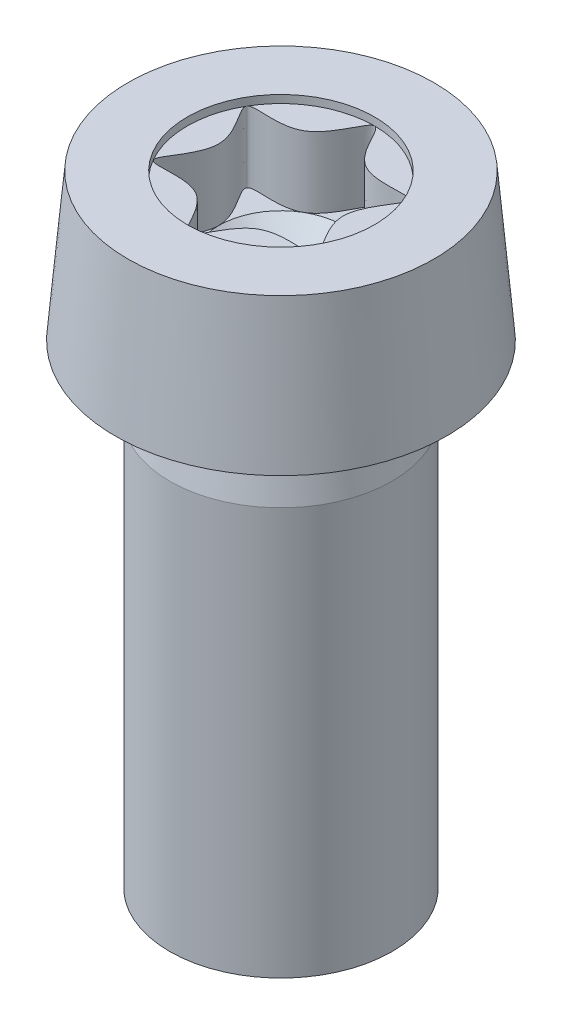
ISO-10303-21;
HEADER;
FILE_DESCRIPTION(('STEP AP214'),'2;1');
FILE_NAME('part.step','',(''),(''),'','','');
FILE_SCHEMA(('AUTOMOTIVE_DESIGN { 1 0 10303 214 1 1 1 1 }'));
ENDSEC;
DATA;
#1=APPLICATION_CONTEXT('core data for automotive mechanical design processes');
#2=APPLICATION_PROTOCOL_DEFINITION('international standard','automotive_design',2000,#1);
#3=PRODUCT_CONTEXT('',#1,'mechanical');
#4=PRODUCT('Part','Part','',(#3));
#5=PRODUCT_RELATED_PRODUCT_CATEGORY('part','',(#4));
#6=PRODUCT_DEFINITION_FORMATION('','',#4);
#7=PRODUCT_DEFINITION_CONTEXT('part definition',#1,'design');
#8=PRODUCT_DEFINITION('design','',#6,#7);
#9=PRODUCT_DEFINITION_SHAPE('','',#8);
#10=(LENGTH_UNIT() NAMED_UNIT(*) SI_UNIT(.MILLI.,.METRE.));
#11=(NAMED_UNIT(*) PLANE_ANGLE_UNIT() SI_UNIT($,.RADIAN.));
#12=(NAMED_UNIT(*) SI_UNIT($,.STERADIAN.) SOLID_ANGLE_UNIT());
#13=UNCERTAINTY_MEASURE_WITH_UNIT(LENGTH_MEASURE(1.E-05),#10,'distance_accuracy_value','');
#14=(GEOMETRIC_REPRESENTATION_CONTEXT(3) GLOBAL_UNCERTAINTY_ASSIGNED_CONTEXT((#13)) GLOBAL_UNIT_ASSIGNED_CONTEXT((#10,
#11,#12)) REPRESENTATION_CONTEXT('',''));
#15=CARTESIAN_POINT('',(0.,0.,0.));
#16=DIRECTION('',(0.,0.,1.));
#17=DIRECTION('',(1.,0.,0.));
#18=AXIS2_PLACEMENT_3D('',#15,#16,#17);
#19=CARTESIAN_POINT('',(0.,11.44,1.975));
#20=DIRECTION('',(0.,1.,0.));
#21=DIRECTION('',(0.,0.,1.));
#22=AXIS2_PLACEMENT_3D('',#19,#20,#21);
#23=PLANE('',#22);
#24=CARTESIAN_POINT('',(0.,11.44,-1.975));
#25=CARTESIAN_POINT('',(0.141989717055241,11.44,-1.975));
#26=CARTESIAN_POINT('',(0.425969151165719,11.44,-0.737800212276023));
#27=CARTESIAN_POINT('',(2.24612339533711,11.44,-1.296799946931));
#28=CARTESIAN_POINT('',(0.851938302331447,11.44,0.));
#29=CARTESIAN_POINT('',(2.24612339533711,11.44,1.29679994693099));
#30=CARTESIAN_POINT('',(0.425969151165728,11.44,0.737800212276034));
#31=CARTESIAN_POINT('',(0.,11.44,2.59359989386198));
#32=CARTESIAN_POINT('',(-0.425969151165736,11.44,0.737800212276045));
#33=CARTESIAN_POINT('',(-2.2461233953371,11.44,1.29679994693099));
#34=CARTESIAN_POINT('',(-0.851938302331446,11.44,0.));
#35=CARTESIAN_POINT('',(-2.2461233953371,11.44,-1.29679994693099));
#36=CARTESIAN_POINT('',(-0.425969151165735,11.44,-0.73780021227603));
#37=CARTESIAN_POINT('',(-0.141989717055244,11.44,-1.975));
#38=CARTESIAN_POINT('',(0.,11.44,-1.975));
#39=B_SPLINE_CURVE_WITH_KNOTS('',3,(#24,#25,#26,#27,#28,#29,#30,#31,#32,#33,#34,#35,#36,#37,
#38),.UNSPECIFIED.,.T.,.F.,(4,1,1,1,1,1,1,1,1,1,1,1,4),(0.,0.0833333333333328,0.166666666666667,
0.25,0.333333333333334,0.416666666666668,0.5,0.583333333333334,0.666666666666667,0.75,
0.833333333333334,0.916666666666666,1.),.UNSPECIFIED.);
#40=CARTESIAN_POINT('',(0.65833333333333,11.44,-1.14026678164951));
#41=VERTEX_POINT('',#40);
#42=CARTESIAN_POINT('',(1.31666666666667,11.44,0.));
#43=VERTEX_POINT('',#42);
#44=EDGE_CURVE('E137',#41,#43,#39,.T.);
#45=ORIENTED_EDGE('',*,*,#44,.F.);
#46=CARTESIAN_POINT('',(0.,11.44,0.));
#47=DIRECTION('',(0.,-1.,0.));
#48=DIRECTION('',(0.,0.,-1.));
#49=AXIS2_PLACEMENT_3D('',#46,#47,#48);
#50=CIRCLE('',#49,1.31666666666667);
#51=EDGE_CURVE('E47',#41,#43,#50,.T.);
#52=ORIENTED_EDGE('',*,*,#51,.T.);
#53=EDGE_LOOP('',(#45,#52));
#54=FACE_BOUND('',#53,.T.);
#55=ADVANCED_FACE('F34',(#54),#23,.T.);
#56=CARTESIAN_POINT('',(0.658333333333331,11.44,1.14026678164951));
#57=VERTEX_POINT('',#56);
#58=EDGE_CURVE('E152',#43,#57,#39,.T.);
#59=ORIENTED_EDGE('',*,*,#58,.F.);
#60=EDGE_CURVE('E11',#43,#57,#50,.T.);
#61=ORIENTED_EDGE('',*,*,#60,.T.);
#62=EDGE_LOOP('',(#59,#61));
#63=FACE_BOUND('',#62,.T.);
#64=ADVANCED_FACE('F104',(#63),#23,.T.);
#65=CARTESIAN_POINT('',(-0.658333333333333,11.44,1.14026678164951));
#66=VERTEX_POINT('',#65);
#67=EDGE_CURVE('E145',#57,#66,#39,.T.);
#68=ORIENTED_EDGE('',*,*,#67,.F.);
#69=EDGE_CURVE('E45',#57,#66,#50,.T.);
#70=ORIENTED_EDGE('',*,*,#69,.T.);
#71=EDGE_LOOP('',(#68,#70));
#72=FACE_BOUND('',#71,.T.);
#73=ADVANCED_FACE('F111',(#72),#23,.T.);
#74=CARTESIAN_POINT('',(-1.31666666666667,11.44,0.));
#75=VERTEX_POINT('',#74);
#76=EDGE_CURVE('E143',#66,#75,#39,.T.);
#77=ORIENTED_EDGE('',*,*,#76,.F.);
#78=EDGE_CURVE('E386',#66,#75,#50,.T.);
#79=ORIENTED_EDGE('',*,*,#78,.T.);
#80=EDGE_LOOP('',(#77,#79));
#81=FACE_BOUND('',#80,.T.);
#82=ADVANCED_FACE('F126',(#81),#23,.T.);
#83=CARTESIAN_POINT('',(-0.658333333333338,11.44,-1.14026678164951));
#84=VERTEX_POINT('',#83);
#85=EDGE_CURVE('E134',#75,#84,#39,.T.);
#86=ORIENTED_EDGE('',*,*,#85,.F.);
#87=EDGE_CURVE('E203',#75,#84,#50,.T.);
#88=ORIENTED_EDGE('',*,*,#87,.T.);
#89=EDGE_LOOP('',(#86,#88));
#90=FACE_BOUND('',#89,.T.);
#91=ADVANCED_FACE('F117',(#90),#23,.T.);
#92=EDGE_CURVE('E130',#84,#41,#39,.T.);
#93=ORIENTED_EDGE('',*,*,#92,.F.);
#94=EDGE_CURVE('E132',#84,#41,#50,.T.);
#95=ORIENTED_EDGE('',*,*,#94,.T.);
#96=EDGE_LOOP('',(#93,#95));
#97=FACE_BOUND('',#96,.T.);
#98=ADVANCED_FACE('F107',(#97),#23,.T.);
#99=CARTESIAN_POINT('',(0.,13.1,0.));
#100=DIRECTION('',(0.,1.,0.));
#101=DIRECTION('',(0.,0.,1.));
#102=AXIS2_PLACEMENT_3D('',#99,#100,#101);
#103=PLANE('',#102);
#104=CARTESIAN_POINT('',(0.,13.1,0.));
#105=DIRECTION('',(0.,1.,0.));
#106=DIRECTION('',(0.,0.,1.));
#107=AXIS2_PLACEMENT_3D('',#104,#105,#106);
#108=CIRCLE('',#107,1.975);
#109=CARTESIAN_POINT('',(0.,13.1,1.975));
#110=VERTEX_POINT('',#109);
#111=EDGE_CURVE('E153',#110,#110,#108,.T.);
#112=ORIENTED_EDGE('',*,*,#111,.F.);
#113=EDGE_LOOP('',(#112));
#114=FACE_BOUND('',#113,.T.);
#115=CARTESIAN_POINT('',(0.,13.1,0.));
#116=DIRECTION('',(0.,-1.,0.));
#117=DIRECTION('',(0.,0.,-1.));
#118=AXIS2_PLACEMENT_3D('',#115,#116,#117);
#119=CIRCLE('',#118,3.22878514306966);
#120=CARTESIAN_POINT('',(0.,13.1,-3.22878514306966));
#121=VERTEX_POINT('',#120);
#122=EDGE_CURVE('E151',#121,#121,#119,.T.);
#123=ORIENTED_EDGE('',*,*,#122,.F.);
#124=EDGE_LOOP('',(#123));
#125=FACE_BOUND('',#124,.T.);
#126=ADVANCED_FACE('F116',(#114,#125),#103,.T.);
#127=CARTESIAN_POINT('',(2.35,0.,0.));
#128=DIRECTION('',(0.,-1.,0.));
#129=DIRECTION('',(0.,0.,-1.));
#130=AXIS2_PLACEMENT_3D('',#127,#128,#129);
#131=PLANE('',#130);
#132=CARTESIAN_POINT('',(0.,0.,0.));
#133=DIRECTION('',(0.,-1.,0.));
#134=DIRECTION('',(0.,0.,-1.));
#135=AXIS2_PLACEMENT_3D('',#132,#133,#134);
#136=CIRCLE('',#135,2.35);
#137=CARTESIAN_POINT('',(0.,0.,-2.35));
#138=VERTEX_POINT('',#137);
#139=EDGE_CURVE('E181',#138,#138,#136,.T.);
#140=ORIENTED_EDGE('',*,*,#139,.T.);
#141=EDGE_LOOP('',(#140));
#142=FACE_BOUND('',#141,.T.);
#143=ADVANCED_FACE('F123',(#142),#131,.T.);
#144=CARTESIAN_POINT('',(0.,0.,0.));
#145=DIRECTION('',(0.,-1.,0.));
#146=DIRECTION('',(0.,0.,-1.));
#147=AXIS2_PLACEMENT_3D('',#144,#145,#146);
#148=CYLINDRICAL_SURFACE('',#147,2.35);
#149=CARTESIAN_POINT('',(0.,8.6,0.));
#150=DIRECTION('',(0.,-1.,0.));
#151=DIRECTION('',(0.,0.,-1.));
#152=AXIS2_PLACEMENT_3D('',#149,#150,#151);
#153=CIRCLE('',#152,2.35);
#154=CARTESIAN_POINT('',(0.,8.6,-2.35));
#155=VERTEX_POINT('',#154);
#156=EDGE_CURVE('E184',#155,#155,#153,.T.);
#157=ORIENTED_EDGE('',*,*,#156,.T.);
#158=EDGE_LOOP('',(#157));
#159=FACE_BOUND('',#158,.T.);
#160=ORIENTED_EDGE('',*,*,#139,.F.);
#161=EDGE_LOOP('',(#160));
#162=FACE_BOUND('',#161,.T.);
#163=ADVANCED_FACE('F171',(#159,#162),#148,.T.);
#164=CARTESIAN_POINT('',(0.,8.6,0.));
#165=DIRECTION('',(0.,-1.,0.));
#166=DIRECTION('',(0.,0.,-1.));
#167=AXIS2_PLACEMENT_3D('',#164,#165,#166);
#168=CONICAL_SURFACE('',#167,2.35,0.197395559849881);
#169=CARTESIAN_POINT('',(0.,9.76077677297236,0.));
#170=DIRECTION('',(0.,-1.,0.));
#171=DIRECTION('',(0.,0.,-1.));
#172=AXIS2_PLACEMENT_3D('',#169,#170,#171);
#173=CIRCLE('',#172,2.11784464540553);
#174=CARTESIAN_POINT('',(0.,9.76077677297236,-2.11784464540553));
#175=VERTEX_POINT('',#174);
#176=EDGE_CURVE('E183',#175,#175,#173,.T.);
#177=ORIENTED_EDGE('',*,*,#176,.T.);
#178=EDGE_LOOP('',(#177));
#179=FACE_BOUND('',#178,.T.);
#180=ORIENTED_EDGE('',*,*,#156,.F.);
#181=EDGE_LOOP('',(#180));
#182=FACE_BOUND('',#181,.T.);
#183=ADVANCED_FACE('F167',(#179,#182),#168,.T.);
#184=CARTESIAN_POINT('',(3.5,10.,0.));
#185=DIRECTION('',(0.,-1.,0.));
#186=DIRECTION('',(0.,0.,-1.));
#187=AXIS2_PLACEMENT_3D('',#184,#185,#186);
#188=PLANE('',#187);
#189=CARTESIAN_POINT('',(0.,10.,0.));
#190=DIRECTION('',(0.,-1.,0.));
#191=DIRECTION('',(0.,0.,-1.));
#192=AXIS2_PLACEMENT_3D('',#189,#190,#191);
#193=CIRCLE('',#192,2.31396078054371);
#194=CARTESIAN_POINT('',(0.,10.,-2.31396078054371));
#195=VERTEX_POINT('',#194);
#196=EDGE_CURVE('E187',#195,#195,#193,.F.);
#197=ORIENTED_EDGE('',*,*,#196,.T.);
#198=EDGE_LOOP('',(#197));
#199=FACE_BOUND('',#198,.T.);
#200=CARTESIAN_POINT('',(0.,10.,0.));
#201=DIRECTION('',(0.,-1.,0.));
#202=DIRECTION('',(0.,0.,-1.));
#203=AXIS2_PLACEMENT_3D('',#200,#201,#202);
#204=CIRCLE('',#203,3.5);
#205=CARTESIAN_POINT('',(0.,10.,-3.5));
#206=VERTEX_POINT('',#205);
#207=EDGE_CURVE('E190',#206,#206,#204,.T.);
#208=ORIENTED_EDGE('',*,*,#207,.T.);
#209=EDGE_LOOP('',(#208));
#210=FACE_BOUND('',#209,.T.);
#211=ADVANCED_FACE('F163',(#199,#210),#188,.T.);
#212=CARTESIAN_POINT('',(0.,10.,0.));
#213=DIRECTION('',(0.,-1.,0.));
#214=DIRECTION('',(0.,0.,-1.));
#215=AXIS2_PLACEMENT_3D('',#212,#213,#214);
#216=CONICAL_SURFACE('',#215,3.5,0.0872664625997097);
#217=ORIENTED_EDGE('',*,*,#122,.T.);
#218=EDGE_LOOP('',(#217));
#219=FACE_BOUND('',#218,.T.);
#220=ORIENTED_EDGE('',*,*,#207,.F.);
#221=EDGE_LOOP('',(#220));
#222=FACE_BOUND('',#221,.T.);
#223=ADVANCED_FACE('F160',(#219,#222),#216,.T.);
#224=CARTESIAN_POINT('',(0.,9.8,0.));
#225=DIRECTION('',(0.,-1.,0.));
#226=DIRECTION('',(0.,0.,-1.));
#227=AXIS2_PLACEMENT_3D('',#224,#225,#226);
#228=TOROIDAL_SURFACE('',#227,2.31396078054371,0.2);
#229=ORIENTED_EDGE('',*,*,#196,.F.);
#230=EDGE_LOOP('',(#229));
#231=FACE_BOUND('',#230,.T.);
#232=ORIENTED_EDGE('',*,*,#176,.F.);
#233=EDGE_LOOP('',(#232));
#234=FACE_BOUND('',#233,.T.);
#235=ADVANCED_FACE('F36',(#231,#234),#228,.F.);
#236=CARTESIAN_POINT('',(0.,12.934,0.));
#237=DIRECTION('',(0.,1.,0.));
#238=DIRECTION('',(0.,0.,1.));
#239=AXIS2_PLACEMENT_3D('',#236,#237,#238);
#240=CYLINDRICAL_SURFACE('',#239,1.975);
#241=ORIENTED_EDGE('',*,*,#111,.T.);
#242=EDGE_LOOP('',(#241));
#243=FACE_BOUND('',#242,.T.);
#244=CARTESIAN_POINT('',(0.,12.934,0.));
#245=DIRECTION('',(0.,1.,0.));
#246=DIRECTION('',(0.,0.,1.));
#247=AXIS2_PLACEMENT_3D('',#244,#245,#246);
#248=CIRCLE('',#247,1.975);
#249=CARTESIAN_POINT('',(1.71040017247427,12.934,0.9875));
#250=VERTEX_POINT('',#249);
#251=CARTESIAN_POINT('',(1.71040017247427,12.934,-0.9875));
#252=VERTEX_POINT('',#251);
#253=EDGE_CURVE('E223',#250,#252,#248,.T.);
#254=ORIENTED_EDGE('',*,*,#253,.F.);
#255=CARTESIAN_POINT('',(0.,12.934,1.975));
#256=VERTEX_POINT('',#255);
#257=EDGE_CURVE('E135',#256,#250,#248,.T.);
#258=ORIENTED_EDGE('',*,*,#257,.F.);
#259=CARTESIAN_POINT('',(-1.71040017247427,12.934,0.987500000000001));
#260=VERTEX_POINT('',#259);
#261=EDGE_CURVE('E214',#260,#256,#248,.T.);
#262=ORIENTED_EDGE('',*,*,#261,.F.);
#263=CARTESIAN_POINT('',(-1.71040017247427,12.934,-0.9875));
#264=VERTEX_POINT('',#263);
#265=EDGE_CURVE('E219',#264,#260,#248,.T.);
#266=ORIENTED_EDGE('',*,*,#265,.F.);
#267=CARTESIAN_POINT('',(0.,12.934,-1.975));
#268=VERTEX_POINT('',#267);
#269=EDGE_CURVE('E263',#268,#264,#248,.T.);
#270=ORIENTED_EDGE('',*,*,#269,.F.);
#271=EDGE_CURVE('E60',#252,#268,#248,.T.);
#272=ORIENTED_EDGE('',*,*,#271,.F.);
#273=EDGE_LOOP('',(#254,#258,#262,#266,#270,#272));
#274=FACE_BOUND('',#273,.T.);
#275=ADVANCED_FACE('F221',(#243,#274),#240,.F.);
#276=CARTESIAN_POINT('',(0.,12.934,0.));
#277=DIRECTION('',(0.,1.,0.));
#278=DIRECTION('',(0.,0.,1.));
#279=AXIS2_PLACEMENT_3D('',#276,#277,#278);
#280=PLANE('',#279);
#281=ORIENTED_EDGE('',*,*,#269,.T.);
#282=CARTESIAN_POINT('',(0.,12.934,-1.975));
#283=CARTESIAN_POINT('',(0.141989717055241,12.934,-1.975));
#284=CARTESIAN_POINT('',(0.425969151165719,12.934,-0.737800212276023));
#285=CARTESIAN_POINT('',(2.24612339533711,12.934,-1.296799946931));
#286=CARTESIAN_POINT('',(0.851938302331447,12.934,0.));
#287=CARTESIAN_POINT('',(2.24612339533711,12.934,1.29679994693099));
#288=CARTESIAN_POINT('',(0.425969151165728,12.934,0.737800212276034));
#289=CARTESIAN_POINT('',(0.,12.934,2.59359989386198));
#290=CARTESIAN_POINT('',(-0.425969151165736,12.934,0.737800212276045));
#291=CARTESIAN_POINT('',(-2.2461233953371,12.934,1.29679994693099));
#292=CARTESIAN_POINT('',(-0.851938302331446,12.934,0.));
#293=CARTESIAN_POINT('',(-2.2461233953371,12.934,-1.29679994693099));
#294=CARTESIAN_POINT('',(-0.425969151165735,12.934,-0.73780021227603));
#295=CARTESIAN_POINT('',(-0.141989717055244,12.934,-1.975));
#296=CARTESIAN_POINT('',(0.,12.934,-1.975));
#297=B_SPLINE_CURVE_WITH_KNOTS('',3,(#282,#283,#284,#285,#286,#287,#288,#289,#290,#291,#292,
#293,#294,#295,#296),.UNSPECIFIED.,.T.,.F.,(4,1,1,1,1,1,1,1,1,1,1,1,4),(0.,0.0833333333333328,
0.166666666666667,0.25,0.333333333333334,0.416666666666668,0.5,0.583333333333334,
0.666666666666667,0.75,0.833333333333334,0.916666666666666,1.),.UNSPECIFIED.);
#298=EDGE_CURVE('E196',#268,#264,#297,.F.);
#299=ORIENTED_EDGE('',*,*,#298,.F.);
#300=EDGE_LOOP('',(#281,#299));
#301=FACE_BOUND('',#300,.T.);
#302=ADVANCED_FACE('F236',(#301),#280,.T.);
#303=ORIENTED_EDGE('',*,*,#265,.T.);
#304=EDGE_CURVE('E200',#264,#260,#297,.F.);
#305=ORIENTED_EDGE('',*,*,#304,.F.);
#306=EDGE_LOOP('',(#303,#305));
#307=FACE_BOUND('',#306,.T.);
#308=ADVANCED_FACE('F241',(#307),#280,.T.);
#309=ORIENTED_EDGE('',*,*,#261,.T.);
#310=EDGE_CURVE('E204',#260,#256,#297,.F.);
#311=ORIENTED_EDGE('',*,*,#310,.F.);
#312=EDGE_LOOP('',(#309,#311));
#313=FACE_BOUND('',#312,.T.);
#314=ADVANCED_FACE('F215',(#313),#280,.T.);
#315=ORIENTED_EDGE('',*,*,#257,.T.);
#316=EDGE_CURVE('E199',#256,#250,#297,.F.);
#317=ORIENTED_EDGE('',*,*,#316,.F.);
#318=EDGE_LOOP('',(#315,#317));
#319=FACE_BOUND('',#318,.T.);
#320=ADVANCED_FACE('F210',(#319),#280,.T.);
#321=ORIENTED_EDGE('',*,*,#253,.T.);
#322=EDGE_CURVE('E195',#250,#252,#297,.F.);
#323=ORIENTED_EDGE('',*,*,#322,.F.);
#324=EDGE_LOOP('',(#321,#323));
#325=FACE_BOUND('',#324,.T.);
#326=ADVANCED_FACE('F245',(#325),#280,.T.);
#327=ORIENTED_EDGE('',*,*,#271,.T.);
#328=EDGE_CURVE('E38',#252,#268,#297,.F.);
#329=ORIENTED_EDGE('',*,*,#328,.F.);
#330=EDGE_LOOP('',(#327,#329));
#331=FACE_BOUND('',#330,.T.);
#332=ADVANCED_FACE('F99',(#331),#280,.T.);
#333=DIRECTION('',(0.,1.,0.));
#334=VECTOR('',#333,1.);
#335=SURFACE_OF_LINEAR_EXTRUSION('',#39,#334);
#336=ORIENTED_EDGE('',*,*,#44,.T.);
#337=ORIENTED_EDGE('',*,*,#58,.T.);
#338=ORIENTED_EDGE('',*,*,#67,.T.);
#339=ORIENTED_EDGE('',*,*,#76,.T.);
#340=ORIENTED_EDGE('',*,*,#85,.T.);
#341=ORIENTED_EDGE('',*,*,#92,.T.);
#342=EDGE_LOOP('',(#336,#337,#338,#339,#340,#341));
#343=FACE_BOUND('',#342,.T.);
#344=ORIENTED_EDGE('',*,*,#328,.T.);
#345=ORIENTED_EDGE('',*,*,#298,.T.);
#346=ORIENTED_EDGE('',*,*,#304,.T.);
#347=ORIENTED_EDGE('',*,*,#310,.T.);
#348=ORIENTED_EDGE('',*,*,#316,.T.);
#349=ORIENTED_EDGE('',*,*,#322,.T.);
#350=EDGE_LOOP('',(#344,#345,#346,#347,#348,#349));
#351=FACE_BOUND('',#350,.T.);
#352=ADVANCED_FACE('F94',(#343,#351),#335,.T.);
#353=CARTESIAN_POINT('',(0.,10.31,0.));
#354=DIRECTION('',(0.,1.,0.));
#355=DIRECTION('',(0.,0.,1.));
#356=AXIS2_PLACEMENT_3D('',#353,#354,#355);
#357=CONICAL_SURFACE('',#356,0.,0.861544924513191);
#358=ORIENTED_EDGE('',*,*,#51,.F.);
#359=ORIENTED_EDGE('',*,*,#94,.F.);
#360=ORIENTED_EDGE('',*,*,#87,.F.);
#361=ORIENTED_EDGE('',*,*,#78,.F.);
#362=ORIENTED_EDGE('',*,*,#69,.F.);
#363=ORIENTED_EDGE('',*,*,#60,.F.);
#364=EDGE_LOOP('',(#358,#359,#360,#361,#362,#363));
#365=FACE_BOUND('',#364,.T.);
#366=CARTESIAN_POINT('',(0.,10.31,0.));
#367=VERTEX_POINT('',#366);
#368=VERTEX_LOOP('',#367);
#369=FACE_BOUND('',#368,.T.);
#370=ADVANCED_FACE('F92',(#365,#369),#357,.F.);
#371=CLOSED_SHELL('',(#55,#64,#73,#82,#91,#98,#126,#143,#163,#183,#211,#223,#235,#275,#302,#308,
#314,#320,#326,#332,#352,#370));
#372=MANIFOLD_SOLID_BREP('B2',#371);
#373=ADVANCED_BREP_SHAPE_REPRESENTATION('',(#18,#372),#14);
#374=SHAPE_DEFINITION_REPRESENTATION(#9,#373);
ENDSEC;
END-ISO-10303-21;
